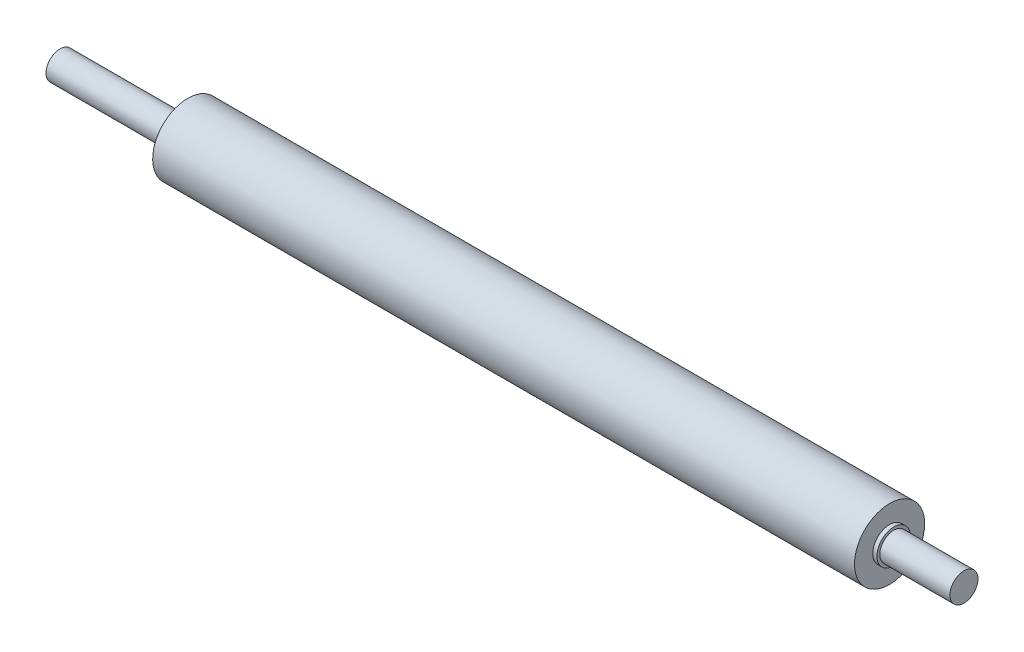
ISO-10303-21;
HEADER;
FILE_DESCRIPTION(('STEP AP214'),'2;1');
FILE_NAME('part.step','',(''),(''),'','','');
FILE_SCHEMA(('AUTOMOTIVE_DESIGN { 1 0 10303 214 1 1 1 1 }'));
ENDSEC;
DATA;
#1=APPLICATION_CONTEXT('core data for automotive mechanical design processes');
#2=APPLICATION_PROTOCOL_DEFINITION('international standard','automotive_design',2000,#1);
#3=PRODUCT_CONTEXT('',#1,'mechanical');
#4=PRODUCT('Part','Part','',(#3));
#5=PRODUCT_RELATED_PRODUCT_CATEGORY('part','',(#4));
#6=PRODUCT_DEFINITION_FORMATION('','',#4);
#7=PRODUCT_DEFINITION_CONTEXT('part definition',#1,'design');
#8=PRODUCT_DEFINITION('design','',#6,#7);
#9=PRODUCT_DEFINITION_SHAPE('','',#8);
#10=(LENGTH_UNIT() NAMED_UNIT(*) SI_UNIT(.MILLI.,.METRE.));
#11=(NAMED_UNIT(*) PLANE_ANGLE_UNIT() SI_UNIT($,.RADIAN.));
#12=(NAMED_UNIT(*) SI_UNIT($,.STERADIAN.) SOLID_ANGLE_UNIT());
#13=UNCERTAINTY_MEASURE_WITH_UNIT(LENGTH_MEASURE(1.E-05),#10,'distance_accuracy_value','');
#14=(GEOMETRIC_REPRESENTATION_CONTEXT(3) GLOBAL_UNCERTAINTY_ASSIGNED_CONTEXT((#13)) GLOBAL_UNIT_ASSIGNED_CONTEXT((#10,
#11,#12)) REPRESENTATION_CONTEXT('',''));
#15=CARTESIAN_POINT('',(0.,0.,0.));
#16=DIRECTION('',(0.,0.,1.));
#17=DIRECTION('',(1.,0.,0.));
#18=AXIS2_PLACEMENT_3D('',#15,#16,#17);
#19=CARTESIAN_POINT('',(303.,0.,0.));
#20=DIRECTION('',(1.,0.,0.));
#21=DIRECTION('',(0.,1.,0.));
#22=AXIS2_PLACEMENT_3D('',#19,#20,#21);
#23=CYLINDRICAL_SURFACE('',#22,10.);
#24=CARTESIAN_POINT('',(-253.,0.,0.));
#25=DIRECTION('',(1.,0.,0.));
#26=DIRECTION('',(0.,1.,0.));
#27=AXIS2_PLACEMENT_3D('',#24,#25,#26);
#28=CIRCLE('',#27,10.);
#29=CARTESIAN_POINT('',(-253.,9.99999999999998,0.));
#30=VERTEX_POINT('',#29);
#31=EDGE_CURVE('E65',#30,#30,#28,.T.);
#32=ORIENTED_EDGE('',*,*,#31,.F.);
#33=EDGE_LOOP('',(#32));
#34=FACE_BOUND('',#33,.T.);
#35=CARTESIAN_POINT('',(-341.,0.,0.));
#36=DIRECTION('',(-1.,0.,0.));
#37=DIRECTION('',(0.,-1.,0.));
#38=AXIS2_PLACEMENT_3D('',#35,#36,#37);
#39=CIRCLE('',#38,10.);
#40=CARTESIAN_POINT('',(-341.,-10.0000000000001,0.));
#41=VERTEX_POINT('',#40);
#42=EDGE_CURVE('E92',#41,#41,#39,.T.);
#43=ORIENTED_EDGE('',*,*,#42,.F.);
#44=EDGE_LOOP('',(#43));
#45=FACE_BOUND('',#44,.T.);
#46=ADVANCED_FACE('F44',(#34,#45),#23,.T.);
#47=CARTESIAN_POINT('',(-253.,9.99999999999998,0.));
#48=DIRECTION('',(-1.,0.,0.));
#49=DIRECTION('',(0.,-1.,0.));
#50=AXIS2_PLACEMENT_3D('',#47,#48,#49);
#51=PLANE('',#50);
#52=ORIENTED_EDGE('',*,*,#31,.T.);
#53=EDGE_LOOP('',(#52));
#54=FACE_BOUND('',#53,.T.);
#55=CARTESIAN_POINT('',(-253.,0.,0.));
#56=DIRECTION('',(1.,0.,0.));
#57=DIRECTION('',(0.,1.,0.));
#58=AXIS2_PLACEMENT_3D('',#55,#56,#57);
#59=CIRCLE('',#58,12.);
#60=CARTESIAN_POINT('',(-253.,12.,0.));
#61=VERTEX_POINT('',#60);
#62=EDGE_CURVE('E68',#61,#61,#59,.T.);
#63=ORIENTED_EDGE('',*,*,#62,.F.);
#64=EDGE_LOOP('',(#63));
#65=FACE_BOUND('',#64,.T.);
#66=ADVANCED_FACE('F99',(#54,#65),#51,.T.);
#67=CARTESIAN_POINT('',(303.,0.,0.));
#68=DIRECTION('',(1.,0.,0.));
#69=DIRECTION('',(0.,1.,0.));
#70=AXIS2_PLACEMENT_3D('',#67,#68,#69);
#71=CYLINDRICAL_SURFACE('',#70,12.);
#72=ORIENTED_EDGE('',*,*,#62,.T.);
#73=EDGE_LOOP('',(#72));
#74=FACE_BOUND('',#73,.T.);
#75=CARTESIAN_POINT('',(-250.,0.,0.));
#76=DIRECTION('',(1.,0.,0.));
#77=DIRECTION('',(0.,1.,0.));
#78=AXIS2_PLACEMENT_3D('',#75,#76,#77);
#79=CIRCLE('',#78,12.);
#80=CARTESIAN_POINT('',(-250.,12.,0.));
#81=VERTEX_POINT('',#80);
#82=EDGE_CURVE('E71',#81,#81,#79,.T.);
#83=ORIENTED_EDGE('',*,*,#82,.F.);
#84=EDGE_LOOP('',(#83));
#85=FACE_BOUND('',#84,.T.);
#86=ADVANCED_FACE('F107',(#74,#85),#71,.T.);
#87=CARTESIAN_POINT('',(-250.,12.,0.));
#88=DIRECTION('',(-1.,0.,0.));
#89=DIRECTION('',(0.,-1.,0.));
#90=AXIS2_PLACEMENT_3D('',#87,#88,#89);
#91=PLANE('',#90);
#92=ORIENTED_EDGE('',*,*,#82,.T.);
#93=EDGE_LOOP('',(#92));
#94=FACE_BOUND('',#93,.T.);
#95=CARTESIAN_POINT('',(-250.,0.,0.));
#96=DIRECTION('',(1.,0.,0.));
#97=DIRECTION('',(0.,1.,0.));
#98=AXIS2_PLACEMENT_3D('',#95,#96,#97);
#99=CIRCLE('',#98,25.);
#100=CARTESIAN_POINT('',(-250.,25.,0.));
#101=VERTEX_POINT('',#100);
#102=EDGE_CURVE('E74',#101,#101,#99,.T.);
#103=ORIENTED_EDGE('',*,*,#102,.F.);
#104=EDGE_LOOP('',(#103));
#105=FACE_BOUND('',#104,.T.);
#106=ADVANCED_FACE('F186',(#94,#105),#91,.T.);
#107=CARTESIAN_POINT('',(303.,0.,0.));
#108=DIRECTION('',(1.,0.,0.));
#109=DIRECTION('',(0.,1.,0.));
#110=AXIS2_PLACEMENT_3D('',#107,#108,#109);
#111=CYLINDRICAL_SURFACE('',#110,25.);
#112=ORIENTED_EDGE('',*,*,#102,.T.);
#113=EDGE_LOOP('',(#112));
#114=FACE_BOUND('',#113,.T.);
#115=CARTESIAN_POINT('',(250.,0.,0.));
#116=DIRECTION('',(1.,0.,0.));
#117=DIRECTION('',(0.,1.,0.));
#118=AXIS2_PLACEMENT_3D('',#115,#116,#117);
#119=CIRCLE('',#118,25.);
#120=CARTESIAN_POINT('',(250.,25.,0.));
#121=VERTEX_POINT('',#120);
#122=EDGE_CURVE('E77',#121,#121,#119,.T.);
#123=ORIENTED_EDGE('',*,*,#122,.F.);
#124=EDGE_LOOP('',(#123));
#125=FACE_BOUND('',#124,.T.);
#126=ADVANCED_FACE('F177',(#114,#125),#111,.T.);
#127=CARTESIAN_POINT('',(250.,12.,0.));
#128=DIRECTION('',(1.,0.,0.));
#129=DIRECTION('',(0.,1.,0.));
#130=AXIS2_PLACEMENT_3D('',#127,#128,#129);
#131=PLANE('',#130);
#132=ORIENTED_EDGE('',*,*,#122,.T.);
#133=EDGE_LOOP('',(#132));
#134=FACE_BOUND('',#133,.T.);
#135=CARTESIAN_POINT('',(250.,0.,0.));
#136=DIRECTION('',(1.,0.,0.));
#137=DIRECTION('',(0.,1.,0.));
#138=AXIS2_PLACEMENT_3D('',#135,#136,#137);
#139=CIRCLE('',#138,12.);
#140=CARTESIAN_POINT('',(250.,12.,0.));
#141=VERTEX_POINT('',#140);
#142=EDGE_CURVE('E80',#141,#141,#139,.T.);
#143=ORIENTED_EDGE('',*,*,#142,.F.);
#144=EDGE_LOOP('',(#143));
#145=FACE_BOUND('',#144,.T.);
#146=ADVANCED_FACE('F168',(#134,#145),#131,.T.);
#147=CARTESIAN_POINT('',(303.,0.,0.));
#148=DIRECTION('',(1.,0.,0.));
#149=DIRECTION('',(0.,1.,0.));
#150=AXIS2_PLACEMENT_3D('',#147,#148,#149);
#151=CYLINDRICAL_SURFACE('',#150,12.);
#152=ORIENTED_EDGE('',*,*,#142,.T.);
#153=EDGE_LOOP('',(#152));
#154=FACE_BOUND('',#153,.T.);
#155=CARTESIAN_POINT('',(253.,0.,0.));
#156=DIRECTION('',(1.,0.,0.));
#157=DIRECTION('',(0.,1.,0.));
#158=AXIS2_PLACEMENT_3D('',#155,#156,#157);
#159=CIRCLE('',#158,12.);
#160=CARTESIAN_POINT('',(253.,12.,0.));
#161=VERTEX_POINT('',#160);
#162=EDGE_CURVE('E83',#161,#161,#159,.T.);
#163=ORIENTED_EDGE('',*,*,#162,.F.);
#164=EDGE_LOOP('',(#163));
#165=FACE_BOUND('',#164,.T.);
#166=ADVANCED_FACE('F159',(#154,#165),#151,.T.);
#167=CARTESIAN_POINT('',(253.,9.99999999999998,0.));
#168=DIRECTION('',(1.,0.,0.));
#169=DIRECTION('',(0.,1.,0.));
#170=AXIS2_PLACEMENT_3D('',#167,#168,#169);
#171=PLANE('',#170);
#172=ORIENTED_EDGE('',*,*,#162,.T.);
#173=EDGE_LOOP('',(#172));
#174=FACE_BOUND('',#173,.T.);
#175=CARTESIAN_POINT('',(253.,0.,0.));
#176=DIRECTION('',(1.,0.,0.));
#177=DIRECTION('',(0.,1.,0.));
#178=AXIS2_PLACEMENT_3D('',#175,#176,#177);
#179=CIRCLE('',#178,9.99999999999999);
#180=CARTESIAN_POINT('',(253.,9.99999999999998,0.));
#181=VERTEX_POINT('',#180);
#182=EDGE_CURVE('E86',#181,#181,#179,.T.);
#183=ORIENTED_EDGE('',*,*,#182,.F.);
#184=EDGE_LOOP('',(#183));
#185=FACE_BOUND('',#184,.T.);
#186=ADVANCED_FACE('F150',(#174,#185),#171,.T.);
#187=CARTESIAN_POINT('',(303.,0.,0.));
#188=DIRECTION('',(1.,0.,0.));
#189=DIRECTION('',(0.,1.,0.));
#190=AXIS2_PLACEMENT_3D('',#187,#188,#189);
#191=CYLINDRICAL_SURFACE('',#190,9.99999999999999);
#192=ORIENTED_EDGE('',*,*,#182,.T.);
#193=EDGE_LOOP('',(#192));
#194=FACE_BOUND('',#193,.T.);
#195=CARTESIAN_POINT('',(303.,0.,0.));
#196=DIRECTION('',(1.,0.,0.));
#197=DIRECTION('',(0.,1.,0.));
#198=AXIS2_PLACEMENT_3D('',#195,#196,#197);
#199=CIRCLE('',#198,9.99999999999999);
#200=CARTESIAN_POINT('',(303.,9.99999999999999,0.));
#201=VERTEX_POINT('',#200);
#202=EDGE_CURVE('E89',#201,#201,#199,.T.);
#203=ORIENTED_EDGE('',*,*,#202,.F.);
#204=EDGE_LOOP('',(#203));
#205=FACE_BOUND('',#204,.T.);
#206=ADVANCED_FACE('F141',(#194,#205),#191,.T.);
#207=CARTESIAN_POINT('',(303.,0.,0.));
#208=DIRECTION('',(1.,0.,0.));
#209=DIRECTION('',(0.,1.,0.));
#210=AXIS2_PLACEMENT_3D('',#207,#208,#209);
#211=PLANE('',#210);
#212=ORIENTED_EDGE('',*,*,#202,.T.);
#213=EDGE_LOOP('',(#212));
#214=FACE_BOUND('',#213,.T.);
#215=ADVANCED_FACE('F138',(#214),#211,.T.);
#216=CARTESIAN_POINT('',(-341.,0.,0.));
#217=DIRECTION('',(-1.,0.,0.));
#218=DIRECTION('',(0.,-1.,0.));
#219=AXIS2_PLACEMENT_3D('',#216,#217,#218);
#220=PLANE('',#219);
#221=ORIENTED_EDGE('',*,*,#42,.T.);
#222=EDGE_LOOP('',(#221));
#223=FACE_BOUND('',#222,.T.);
#224=ADVANCED_FACE('F96',(#223),#220,.T.);
#225=CLOSED_SHELL('',(#46,#66,#86,#106,#126,#146,#166,#186,#206,#215,#224));
#226=CARTESIAN_POINT('',(303.,0.,0.));
#227=DIRECTION('',(1.,0.,0.));
#228=DIRECTION('',(0.,1.,0.));
#229=AXIS2_PLACEMENT_3D('',#226,#227,#228);
#230=CYLINDRICAL_SURFACE('',#229,12.);
#231=CARTESIAN_POINT('',(247.,0.,0.));
#232=DIRECTION('',(1.,0.,0.));
#233=DIRECTION('',(0.,1.,0.));
#234=AXIS2_PLACEMENT_3D('',#231,#232,#233);
#235=CIRCLE('',#234,12.);
#236=CARTESIAN_POINT('',(247.,12.,0.));
#237=VERTEX_POINT('',#236);
#238=EDGE_CURVE('E10',#237,#237,#235,.T.);
#239=ORIENTED_EDGE('',*,*,#238,.F.);
#240=EDGE_LOOP('',(#239));
#241=FACE_BOUND('',#240,.T.);
#242=CARTESIAN_POINT('',(-247.,0.,0.));
#243=DIRECTION('',(1.,0.,0.));
#244=DIRECTION('',(0.,1.,0.));
#245=AXIS2_PLACEMENT_3D('',#242,#243,#244);
#246=CIRCLE('',#245,12.);
#247=CARTESIAN_POINT('',(-247.,12.,0.));
#248=VERTEX_POINT('',#247);
#249=EDGE_CURVE('E60',#248,#248,#246,.T.);
#250=ORIENTED_EDGE('',*,*,#249,.T.);
#251=EDGE_LOOP('',(#250));
#252=FACE_BOUND('',#251,.T.);
#253=ADVANCED_FACE('F46',(#241,#252),#230,.T.);
#254=CARTESIAN_POINT('',(247.,21.9999999999999,0.));
#255=DIRECTION('',(1.,0.,0.));
#256=DIRECTION('',(0.,1.,0.));
#257=AXIS2_PLACEMENT_3D('',#254,#255,#256);
#258=PLANE('',#257);
#259=CARTESIAN_POINT('',(247.,0.,0.));
#260=DIRECTION('',(1.,0.,0.));
#261=DIRECTION('',(0.,1.,0.));
#262=AXIS2_PLACEMENT_3D('',#259,#260,#261);
#263=CIRCLE('',#262,21.9999999999999);
#264=CARTESIAN_POINT('',(247.,21.9999999999999,0.));
#265=VERTEX_POINT('',#264);
#266=EDGE_CURVE('E52',#265,#265,#263,.T.);
#267=ORIENTED_EDGE('',*,*,#266,.F.);
#268=EDGE_LOOP('',(#267));
#269=FACE_BOUND('',#268,.T.);
#270=ORIENTED_EDGE('',*,*,#238,.T.);
#271=EDGE_LOOP('',(#270));
#272=FACE_BOUND('',#271,.T.);
#273=ADVANCED_FACE('F119',(#269,#272),#258,.F.);
#274=CARTESIAN_POINT('',(303.,0.,0.));
#275=DIRECTION('',(1.,0.,0.));
#276=DIRECTION('',(0.,1.,0.));
#277=AXIS2_PLACEMENT_3D('',#274,#275,#276);
#278=CYLINDRICAL_SURFACE('',#277,21.9999999999999);
#279=CARTESIAN_POINT('',(-247.,0.,0.));
#280=DIRECTION('',(1.,0.,0.));
#281=DIRECTION('',(0.,1.,0.));
#282=AXIS2_PLACEMENT_3D('',#279,#280,#281);
#283=CIRCLE('',#282,21.9999999999999);
#284=CARTESIAN_POINT('',(-247.,21.9999999999999,0.));
#285=VERTEX_POINT('',#284);
#286=EDGE_CURVE('E56',#285,#285,#283,.T.);
#287=ORIENTED_EDGE('',*,*,#286,.F.);
#288=EDGE_LOOP('',(#287));
#289=FACE_BOUND('',#288,.T.);
#290=ORIENTED_EDGE('',*,*,#266,.T.);
#291=EDGE_LOOP('',(#290));
#292=FACE_BOUND('',#291,.T.);
#293=ADVANCED_FACE('F115',(#289,#292),#278,.F.);
#294=CARTESIAN_POINT('',(-247.,21.9999999999999,0.));
#295=DIRECTION('',(-1.,0.,0.));
#296=DIRECTION('',(0.,-1.,0.));
#297=AXIS2_PLACEMENT_3D('',#294,#295,#296);
#298=PLANE('',#297);
#299=ORIENTED_EDGE('',*,*,#249,.F.);
#300=EDGE_LOOP('',(#299));
#301=FACE_BOUND('',#300,.T.);
#302=ORIENTED_EDGE('',*,*,#286,.T.);
#303=EDGE_LOOP('',(#302));
#304=FACE_BOUND('',#303,.T.);
#305=ADVANCED_FACE('F113',(#301,#304),#298,.F.);
#306=CLOSED_SHELL('',(#253,#273,#293,#305));
#307=ORIENTED_CLOSED_SHELL('',*,#306,.T.);
#308=BREP_WITH_VOIDS('B2',#225,(#307));
#309=ADVANCED_BREP_SHAPE_REPRESENTATION('',(#18,#308),#14);
#310=SHAPE_DEFINITION_REPRESENTATION(#9,#309);
ENDSEC;
END-ISO-10303-21;
